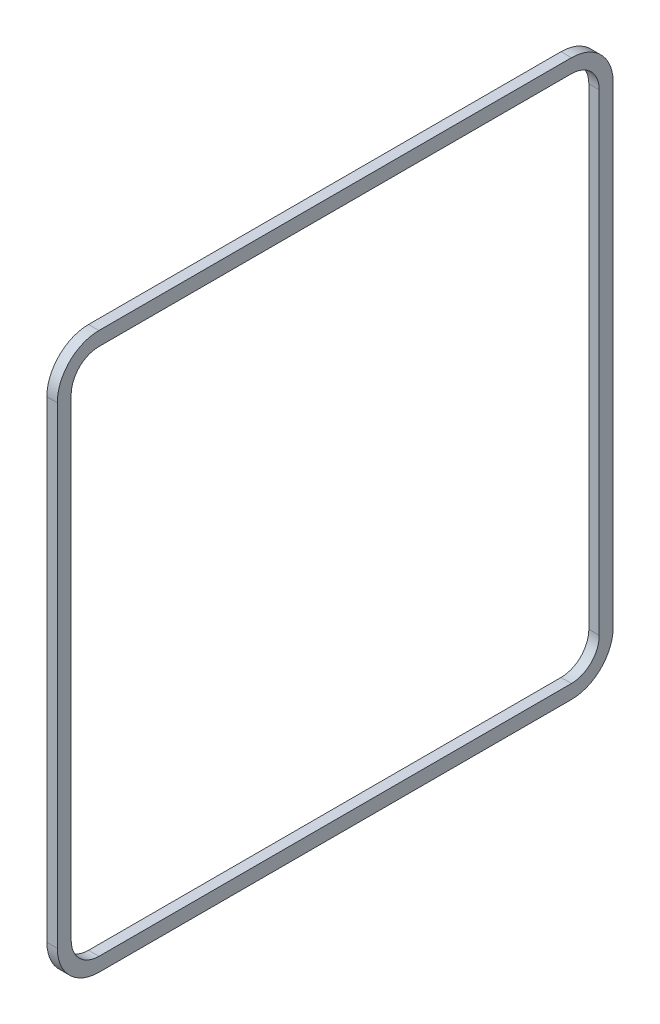
ISO-10303-21;
HEADER;
FILE_DESCRIPTION(('STEP AP214'),'2;1');
FILE_NAME('part.step','',(''),(''),'','','');
FILE_SCHEMA(('AUTOMOTIVE_DESIGN { 1 0 10303 214 1 1 1 1 }'));
ENDSEC;
DATA;
#1=APPLICATION_CONTEXT('core data for automotive mechanical design processes');
#2=APPLICATION_PROTOCOL_DEFINITION('international standard','automotive_design',2000,#1);
#3=PRODUCT_CONTEXT('',#1,'mechanical');
#4=PRODUCT('Part','Part','',(#3));
#5=PRODUCT_RELATED_PRODUCT_CATEGORY('part','',(#4));
#6=PRODUCT_DEFINITION_FORMATION('','',#4);
#7=PRODUCT_DEFINITION_CONTEXT('part definition',#1,'design');
#8=PRODUCT_DEFINITION('design','',#6,#7);
#9=PRODUCT_DEFINITION_SHAPE('','',#8);
#10=(LENGTH_UNIT() NAMED_UNIT(*) SI_UNIT(.MILLI.,.METRE.));
#11=(NAMED_UNIT(*) PLANE_ANGLE_UNIT() SI_UNIT($,.RADIAN.));
#12=(NAMED_UNIT(*) SI_UNIT($,.STERADIAN.) SOLID_ANGLE_UNIT());
#13=UNCERTAINTY_MEASURE_WITH_UNIT(LENGTH_MEASURE(1.E-05),#10,'distance_accuracy_value','');
#14=(GEOMETRIC_REPRESENTATION_CONTEXT(3) GLOBAL_UNCERTAINTY_ASSIGNED_CONTEXT((#13)) GLOBAL_UNIT_ASSIGNED_CONTEXT((#10,
#11,#12)) REPRESENTATION_CONTEXT('',''));
#15=CARTESIAN_POINT('',(0.,0.,0.));
#16=DIRECTION('',(0.,0.,1.));
#17=DIRECTION('',(1.,0.,0.));
#18=AXIS2_PLACEMENT_3D('',#15,#16,#17);
#19=CARTESIAN_POINT('',(1.5,-34.,34.));
#20=DIRECTION('',(1.,0.,0.));
#21=DIRECTION('',(0.,0.,-1.));
#22=AXIS2_PLACEMENT_3D('',#19,#20,#21);
#23=PLANE('',#22);
#24=CARTESIAN_POINT('',(1.5,-34.,34.));
#25=DIRECTION('',(1.,0.,0.));
#26=DIRECTION('',(0.,0.,-1.));
#27=AXIS2_PLACEMENT_3D('',#24,#25,#26);
#28=CIRCLE('',#27,6.);
#29=CARTESIAN_POINT('',(1.5,-34.,40.));
#30=VERTEX_POINT('',#29);
#31=CARTESIAN_POINT('',(1.5,-40.,34.));
#32=VERTEX_POINT('',#31);
#33=EDGE_CURVE('E213',#30,#32,#28,.T.);
#34=ORIENTED_EDGE('',*,*,#33,.T.);
#35=DIRECTION('',(0.,0.,-1.));
#36=VECTOR('',#35,1.);
#37=CARTESIAN_POINT('',(1.5,-40.,-34.));
#38=LINE('',#37,#36);
#39=CARTESIAN_POINT('',(1.5,-40.,-34.));
#40=VERTEX_POINT('',#39);
#41=EDGE_CURVE('E216',#32,#40,#38,.T.);
#42=ORIENTED_EDGE('',*,*,#41,.T.);
#43=CARTESIAN_POINT('',(1.5,-34.,-34.));
#44=DIRECTION('',(1.,0.,0.));
#45=DIRECTION('',(0.,0.,-1.));
#46=AXIS2_PLACEMENT_3D('',#43,#44,#45);
#47=CIRCLE('',#46,6.);
#48=CARTESIAN_POINT('',(1.5,-34.,-40.));
#49=VERTEX_POINT('',#48);
#50=EDGE_CURVE('E219',#40,#49,#47,.T.);
#51=ORIENTED_EDGE('',*,*,#50,.T.);
#52=DIRECTION('',(0.,1.,0.));
#53=VECTOR('',#52,1.);
#54=CARTESIAN_POINT('',(1.5,-34.,-40.));
#55=LINE('',#54,#53);
#56=CARTESIAN_POINT('',(1.5,34.,-40.));
#57=VERTEX_POINT('',#56);
#58=EDGE_CURVE('E221',#49,#57,#55,.T.);
#59=ORIENTED_EDGE('',*,*,#58,.T.);
#60=CARTESIAN_POINT('',(1.5,34.,-34.));
#61=DIRECTION('',(1.,0.,0.));
#62=DIRECTION('',(0.,0.,-1.));
#63=AXIS2_PLACEMENT_3D('',#60,#61,#62);
#64=CIRCLE('',#63,6.);
#65=CARTESIAN_POINT('',(1.5,40.,-34.));
#66=VERTEX_POINT('',#65);
#67=EDGE_CURVE('E223',#57,#66,#64,.T.);
#68=ORIENTED_EDGE('',*,*,#67,.T.);
#69=DIRECTION('',(0.,0.,1.));
#70=VECTOR('',#69,1.);
#71=CARTESIAN_POINT('',(1.5,40.,-34.));
#72=LINE('',#71,#70);
#73=CARTESIAN_POINT('',(1.5,40.,34.));
#74=VERTEX_POINT('',#73);
#75=EDGE_CURVE('E225',#66,#74,#72,.T.);
#76=ORIENTED_EDGE('',*,*,#75,.T.);
#77=CARTESIAN_POINT('',(1.5,34.,34.));
#78=DIRECTION('',(1.,0.,0.));
#79=DIRECTION('',(0.,0.,1.));
#80=AXIS2_PLACEMENT_3D('',#77,#78,#79);
#81=CIRCLE('',#80,5.99999999999999);
#82=CARTESIAN_POINT('',(1.5,34.,40.));
#83=VERTEX_POINT('',#82);
#84=EDGE_CURVE('E227',#74,#83,#81,.T.);
#85=ORIENTED_EDGE('',*,*,#84,.T.);
#86=DIRECTION('',(0.,-1.,0.));
#87=VECTOR('',#86,1.);
#88=CARTESIAN_POINT('',(1.5,-34.,40.));
#89=LINE('',#88,#87);
#90=EDGE_CURVE('E229',#83,#30,#89,.T.);
#91=ORIENTED_EDGE('',*,*,#90,.T.);
#92=EDGE_LOOP('',(#34,#42,#51,#59,#68,#76,#85,#91));
#93=FACE_BOUND('',#92,.T.);
#94=DIRECTION('',(0.,0.,1.));
#95=VECTOR('',#94,1.);
#96=CARTESIAN_POINT('',(1.5,38.,-34.));
#97=LINE('',#96,#95);
#98=CARTESIAN_POINT('',(1.5,38.,-34.));
#99=VERTEX_POINT('',#98);
#100=CARTESIAN_POINT('',(1.5,38.,34.));
#101=VERTEX_POINT('',#100);
#102=EDGE_CURVE('E156',#99,#101,#97,.T.);
#103=ORIENTED_EDGE('',*,*,#102,.F.);
#104=CARTESIAN_POINT('',(1.5,34.,-34.));
#105=DIRECTION('',(1.,0.,0.));
#106=DIRECTION('',(0.,0.,-1.));
#107=AXIS2_PLACEMENT_3D('',#104,#105,#106);
#108=CIRCLE('',#107,4.);
#109=CARTESIAN_POINT('',(1.5,34.,-38.));
#110=VERTEX_POINT('',#109);
#111=EDGE_CURVE('E148',#110,#99,#108,.T.);
#112=ORIENTED_EDGE('',*,*,#111,.F.);
#113=DIRECTION('',(0.,1.,0.));
#114=VECTOR('',#113,1.);
#115=CARTESIAN_POINT('',(1.5,-34.,-38.));
#116=LINE('',#115,#114);
#117=CARTESIAN_POINT('',(1.5,-34.,-38.));
#118=VERTEX_POINT('',#117);
#119=EDGE_CURVE('E181',#118,#110,#116,.T.);
#120=ORIENTED_EDGE('',*,*,#119,.F.);
#121=CARTESIAN_POINT('',(1.5,-34.,-34.));
#122=DIRECTION('',(1.,0.,0.));
#123=DIRECTION('',(0.,0.,-1.));
#124=AXIS2_PLACEMENT_3D('',#121,#122,#123);
#125=CIRCLE('',#124,4.);
#126=CARTESIAN_POINT('',(1.5,-38.,-34.));
#127=VERTEX_POINT('',#126);
#128=EDGE_CURVE('E179',#127,#118,#125,.T.);
#129=ORIENTED_EDGE('',*,*,#128,.F.);
#130=DIRECTION('',(0.,0.,-1.));
#131=VECTOR('',#130,1.);
#132=CARTESIAN_POINT('',(1.5,-38.,-34.));
#133=LINE('',#132,#131);
#134=CARTESIAN_POINT('',(1.5,-38.,34.));
#135=VERTEX_POINT('',#134);
#136=EDGE_CURVE('E177',#135,#127,#133,.T.);
#137=ORIENTED_EDGE('',*,*,#136,.F.);
#138=CARTESIAN_POINT('',(1.5,-34.,34.));
#139=DIRECTION('',(1.,0.,0.));
#140=DIRECTION('',(0.,0.,-1.));
#141=AXIS2_PLACEMENT_3D('',#138,#139,#140);
#142=CIRCLE('',#141,4.);
#143=CARTESIAN_POINT('',(1.5,-34.,38.));
#144=VERTEX_POINT('',#143);
#145=EDGE_CURVE('E175',#144,#135,#142,.T.);
#146=ORIENTED_EDGE('',*,*,#145,.F.);
#147=DIRECTION('',(0.,-1.,0.));
#148=VECTOR('',#147,1.);
#149=CARTESIAN_POINT('',(1.5,-34.,38.));
#150=LINE('',#149,#148);
#151=CARTESIAN_POINT('',(1.5,34.,38.));
#152=VERTEX_POINT('',#151);
#153=EDGE_CURVE('E171',#152,#144,#150,.T.);
#154=ORIENTED_EDGE('',*,*,#153,.F.);
#155=CARTESIAN_POINT('',(1.5,34.,34.));
#156=DIRECTION('',(1.,0.,0.));
#157=DIRECTION('',(0.,0.,1.));
#158=AXIS2_PLACEMENT_3D('',#155,#156,#157);
#159=CIRCLE('',#158,4.);
#160=EDGE_CURVE('E169',#101,#152,#159,.T.);
#161=ORIENTED_EDGE('',*,*,#160,.F.);
#162=EDGE_LOOP('',(#103,#112,#120,#129,#137,#146,#154,#161));
#163=FACE_BOUND('',#162,.T.);
#164=ADVANCED_FACE('F35',(#93,#163),#23,.T.);
#165=CARTESIAN_POINT('',(0.,-34.,34.));
#166=DIRECTION('',(1.,0.,0.));
#167=DIRECTION('',(0.,0.,-1.));
#168=AXIS2_PLACEMENT_3D('',#165,#166,#167);
#169=PLANE('',#168);
#170=CARTESIAN_POINT('',(0.,-34.,34.));
#171=DIRECTION('',(1.,0.,0.));
#172=DIRECTION('',(0.,0.,-1.));
#173=AXIS2_PLACEMENT_3D('',#170,#171,#172);
#174=CIRCLE('',#173,6.);
#175=CARTESIAN_POINT('',(0.,-34.,40.));
#176=VERTEX_POINT('',#175);
#177=CARTESIAN_POINT('',(0.,-40.,34.));
#178=VERTEX_POINT('',#177);
#179=EDGE_CURVE('E164',#176,#178,#174,.T.);
#180=ORIENTED_EDGE('',*,*,#179,.F.);
#181=DIRECTION('',(0.,-1.,0.));
#182=VECTOR('',#181,1.);
#183=CARTESIAN_POINT('',(0.,-34.,40.));
#184=LINE('',#183,#182);
#185=CARTESIAN_POINT('',(0.,34.,40.));
#186=VERTEX_POINT('',#185);
#187=EDGE_CURVE('E217',#186,#176,#184,.T.);
#188=ORIENTED_EDGE('',*,*,#187,.F.);
#189=CARTESIAN_POINT('',(0.,34.,34.));
#190=DIRECTION('',(1.,0.,0.));
#191=DIRECTION('',(0.,0.,1.));
#192=AXIS2_PLACEMENT_3D('',#189,#190,#191);
#193=CIRCLE('',#192,5.99999999999999);
#194=CARTESIAN_POINT('',(0.,40.,34.));
#195=VERTEX_POINT('',#194);
#196=EDGE_CURVE('E244',#195,#186,#193,.T.);
#197=ORIENTED_EDGE('',*,*,#196,.F.);
#198=DIRECTION('',(0.,0.,1.));
#199=VECTOR('',#198,1.);
#200=CARTESIAN_POINT('',(0.,40.,-34.));
#201=LINE('',#200,#199);
#202=CARTESIAN_POINT('',(0.,40.,-34.));
#203=VERTEX_POINT('',#202);
#204=EDGE_CURVE('E242',#203,#195,#201,.T.);
#205=ORIENTED_EDGE('',*,*,#204,.F.);
#206=CARTESIAN_POINT('',(0.,34.,-34.));
#207=DIRECTION('',(1.,0.,0.));
#208=DIRECTION('',(0.,0.,-1.));
#209=AXIS2_PLACEMENT_3D('',#206,#207,#208);
#210=CIRCLE('',#209,6.);
#211=CARTESIAN_POINT('',(0.,34.,-40.));
#212=VERTEX_POINT('',#211);
#213=EDGE_CURVE('E240',#212,#203,#210,.T.);
#214=ORIENTED_EDGE('',*,*,#213,.F.);
#215=DIRECTION('',(0.,1.,0.));
#216=VECTOR('',#215,1.);
#217=CARTESIAN_POINT('',(0.,-34.,-40.));
#218=LINE('',#217,#216);
#219=CARTESIAN_POINT('',(0.,-34.,-40.));
#220=VERTEX_POINT('',#219);
#221=EDGE_CURVE('E238',#220,#212,#218,.T.);
#222=ORIENTED_EDGE('',*,*,#221,.F.);
#223=CARTESIAN_POINT('',(0.,-34.,-34.));
#224=DIRECTION('',(1.,0.,0.));
#225=DIRECTION('',(0.,0.,-1.));
#226=AXIS2_PLACEMENT_3D('',#223,#224,#225);
#227=CIRCLE('',#226,6.);
#228=CARTESIAN_POINT('',(0.,-40.,-34.));
#229=VERTEX_POINT('',#228);
#230=EDGE_CURVE('E236',#229,#220,#227,.T.);
#231=ORIENTED_EDGE('',*,*,#230,.F.);
#232=DIRECTION('',(0.,0.,-1.));
#233=VECTOR('',#232,1.);
#234=CARTESIAN_POINT('',(0.,-40.,-34.));
#235=LINE('',#234,#233);
#236=EDGE_CURVE('E234',#178,#229,#235,.T.);
#237=ORIENTED_EDGE('',*,*,#236,.F.);
#238=EDGE_LOOP('',(#180,#188,#197,#205,#214,#222,#231,#237));
#239=FACE_BOUND('',#238,.T.);
#240=CARTESIAN_POINT('',(0.,34.,-34.));
#241=DIRECTION('',(1.,0.,0.));
#242=DIRECTION('',(0.,0.,-1.));
#243=AXIS2_PLACEMENT_3D('',#240,#241,#242);
#244=CIRCLE('',#243,4.);
#245=CARTESIAN_POINT('',(0.,34.,-38.));
#246=VERTEX_POINT('',#245);
#247=CARTESIAN_POINT('',(0.,38.,-34.));
#248=VERTEX_POINT('',#247);
#249=EDGE_CURVE('E58',#246,#248,#244,.T.);
#250=ORIENTED_EDGE('',*,*,#249,.T.);
#251=DIRECTION('',(0.,0.,1.));
#252=VECTOR('',#251,1.);
#253=CARTESIAN_POINT('',(0.,38.,-34.));
#254=LINE('',#253,#252);
#255=CARTESIAN_POINT('',(0.,38.,34.));
#256=VERTEX_POINT('',#255);
#257=EDGE_CURVE('E163',#248,#256,#254,.T.);
#258=ORIENTED_EDGE('',*,*,#257,.T.);
#259=CARTESIAN_POINT('',(0.,34.,34.));
#260=DIRECTION('',(1.,0.,0.));
#261=DIRECTION('',(0.,0.,1.));
#262=AXIS2_PLACEMENT_3D('',#259,#260,#261);
#263=CIRCLE('',#262,4.);
#264=CARTESIAN_POINT('',(0.,34.,38.));
#265=VERTEX_POINT('',#264);
#266=EDGE_CURVE('E185',#256,#265,#263,.T.);
#267=ORIENTED_EDGE('',*,*,#266,.T.);
#268=DIRECTION('',(0.,-1.,0.));
#269=VECTOR('',#268,1.);
#270=CARTESIAN_POINT('',(0.,-34.,38.));
#271=LINE('',#270,#269);
#272=CARTESIAN_POINT('',(0.,-34.,38.));
#273=VERTEX_POINT('',#272);
#274=EDGE_CURVE('E188',#265,#273,#271,.T.);
#275=ORIENTED_EDGE('',*,*,#274,.T.);
#276=CARTESIAN_POINT('',(0.,-34.,34.));
#277=DIRECTION('',(1.,0.,0.));
#278=DIRECTION('',(0.,0.,-1.));
#279=AXIS2_PLACEMENT_3D('',#276,#277,#278);
#280=CIRCLE('',#279,4.);
#281=CARTESIAN_POINT('',(0.,-38.,34.));
#282=VERTEX_POINT('',#281);
#283=EDGE_CURVE('E191',#273,#282,#280,.T.);
#284=ORIENTED_EDGE('',*,*,#283,.T.);
#285=DIRECTION('',(0.,0.,-1.));
#286=VECTOR('',#285,1.);
#287=CARTESIAN_POINT('',(0.,-38.,-34.));
#288=LINE('',#287,#286);
#289=CARTESIAN_POINT('',(0.,-38.,-34.));
#290=VERTEX_POINT('',#289);
#291=EDGE_CURVE('E194',#282,#290,#288,.T.);
#292=ORIENTED_EDGE('',*,*,#291,.T.);
#293=CARTESIAN_POINT('',(0.,-34.,-34.));
#294=DIRECTION('',(1.,0.,0.));
#295=DIRECTION('',(0.,0.,-1.));
#296=AXIS2_PLACEMENT_3D('',#293,#294,#295);
#297=CIRCLE('',#296,4.);
#298=CARTESIAN_POINT('',(0.,-34.,-38.));
#299=VERTEX_POINT('',#298);
#300=EDGE_CURVE('E197',#290,#299,#297,.T.);
#301=ORIENTED_EDGE('',*,*,#300,.T.);
#302=DIRECTION('',(0.,1.,0.));
#303=VECTOR('',#302,1.);
#304=CARTESIAN_POINT('',(0.,-34.,-38.));
#305=LINE('',#304,#303);
#306=EDGE_CURVE('E157',#299,#246,#305,.T.);
#307=ORIENTED_EDGE('',*,*,#306,.T.);
#308=EDGE_LOOP('',(#250,#258,#267,#275,#284,#292,#301,#307));
#309=FACE_BOUND('',#308,.T.);
#310=ADVANCED_FACE('F274',(#239,#309),#169,.F.);
#311=CARTESIAN_POINT('',(1.5,-34.,34.));
#312=DIRECTION('',(-1.,0.,0.));
#313=DIRECTION('',(0.,0.,1.));
#314=AXIS2_PLACEMENT_3D('',#311,#312,#313);
#315=CYLINDRICAL_SURFACE('',#314,6.);
#316=ORIENTED_EDGE('',*,*,#179,.T.);
#317=DIRECTION('',(-1.,0.,0.));
#318=VECTOR('',#317,1.);
#319=CARTESIAN_POINT('',(1.5,-40.,34.));
#320=LINE('',#319,#318);
#321=EDGE_CURVE('E11',#32,#178,#320,.T.);
#322=ORIENTED_EDGE('',*,*,#321,.F.);
#323=ORIENTED_EDGE('',*,*,#33,.F.);
#324=DIRECTION('',(-1.,0.,0.));
#325=VECTOR('',#324,1.);
#326=CARTESIAN_POINT('',(1.5,-34.,40.));
#327=LINE('',#326,#325);
#328=EDGE_CURVE('E231',#30,#176,#327,.T.);
#329=ORIENTED_EDGE('',*,*,#328,.T.);
#330=EDGE_LOOP('',(#316,#322,#323,#329));
#331=FACE_BOUND('',#330,.T.);
#332=ADVANCED_FACE('F37',(#331),#315,.T.);
#333=CARTESIAN_POINT('',(1.5,-40.,-34.));
#334=DIRECTION('',(0.,1.,0.));
#335=DIRECTION('',(0.,0.,1.));
#336=AXIS2_PLACEMENT_3D('',#333,#334,#335);
#337=PLANE('',#336);
#338=ORIENTED_EDGE('',*,*,#236,.T.);
#339=DIRECTION('',(-1.,0.,0.));
#340=VECTOR('',#339,1.);
#341=CARTESIAN_POINT('',(1.5,-40.,-34.));
#342=LINE('',#341,#340);
#343=EDGE_CURVE('E43',#40,#229,#342,.T.);
#344=ORIENTED_EDGE('',*,*,#343,.F.);
#345=ORIENTED_EDGE('',*,*,#41,.F.);
#346=ORIENTED_EDGE('',*,*,#321,.T.);
#347=EDGE_LOOP('',(#338,#344,#345,#346));
#348=FACE_BOUND('',#347,.T.);
#349=ADVANCED_FACE('F291',(#348),#337,.F.);
#350=CARTESIAN_POINT('',(1.5,-34.,-34.));
#351=DIRECTION('',(-1.,0.,0.));
#352=DIRECTION('',(0.,0.,1.));
#353=AXIS2_PLACEMENT_3D('',#350,#351,#352);
#354=CYLINDRICAL_SURFACE('',#353,6.);
#355=ORIENTED_EDGE('',*,*,#230,.T.);
#356=DIRECTION('',(-1.,0.,0.));
#357=VECTOR('',#356,1.);
#358=CARTESIAN_POINT('',(1.5,-34.,-40.));
#359=LINE('',#358,#357);
#360=EDGE_CURVE('E261',#49,#220,#359,.T.);
#361=ORIENTED_EDGE('',*,*,#360,.F.);
#362=ORIENTED_EDGE('',*,*,#50,.F.);
#363=ORIENTED_EDGE('',*,*,#343,.T.);
#364=EDGE_LOOP('',(#355,#361,#362,#363));
#365=FACE_BOUND('',#364,.T.);
#366=ADVANCED_FACE('F268',(#365),#354,.T.);
#367=CARTESIAN_POINT('',(1.5,-34.,-40.));
#368=DIRECTION('',(0.,0.,1.));
#369=DIRECTION('',(0.,-1.,0.));
#370=AXIS2_PLACEMENT_3D('',#367,#368,#369);
#371=PLANE('',#370);
#372=ORIENTED_EDGE('',*,*,#221,.T.);
#373=DIRECTION('',(-1.,0.,0.));
#374=VECTOR('',#373,1.);
#375=CARTESIAN_POINT('',(1.5,34.,-40.));
#376=LINE('',#375,#374);
#377=EDGE_CURVE('E258',#57,#212,#376,.T.);
#378=ORIENTED_EDGE('',*,*,#377,.F.);
#379=ORIENTED_EDGE('',*,*,#58,.F.);
#380=ORIENTED_EDGE('',*,*,#360,.T.);
#381=EDGE_LOOP('',(#372,#378,#379,#380));
#382=FACE_BOUND('',#381,.T.);
#383=ADVANCED_FACE('F280',(#382),#371,.F.);
#384=CARTESIAN_POINT('',(1.5,34.,-34.));
#385=DIRECTION('',(-1.,0.,0.));
#386=DIRECTION('',(0.,0.,1.));
#387=AXIS2_PLACEMENT_3D('',#384,#385,#386);
#388=CYLINDRICAL_SURFACE('',#387,6.);
#389=ORIENTED_EDGE('',*,*,#213,.T.);
#390=DIRECTION('',(-1.,0.,0.));
#391=VECTOR('',#390,1.);
#392=CARTESIAN_POINT('',(1.5,40.,-34.));
#393=LINE('',#392,#391);
#394=EDGE_CURVE('E255',#66,#203,#393,.T.);
#395=ORIENTED_EDGE('',*,*,#394,.F.);
#396=ORIENTED_EDGE('',*,*,#67,.F.);
#397=ORIENTED_EDGE('',*,*,#377,.T.);
#398=EDGE_LOOP('',(#389,#395,#396,#397));
#399=FACE_BOUND('',#398,.T.);
#400=ADVANCED_FACE('F284',(#399),#388,.T.);
#401=CARTESIAN_POINT('',(1.5,40.,-34.));
#402=DIRECTION('',(0.,-1.,0.));
#403=DIRECTION('',(0.,0.,-1.));
#404=AXIS2_PLACEMENT_3D('',#401,#402,#403);
#405=PLANE('',#404);
#406=ORIENTED_EDGE('',*,*,#204,.T.);
#407=DIRECTION('',(-1.,0.,0.));
#408=VECTOR('',#407,1.);
#409=CARTESIAN_POINT('',(1.5,40.,34.));
#410=LINE('',#409,#408);
#411=EDGE_CURVE('E252',#74,#195,#410,.T.);
#412=ORIENTED_EDGE('',*,*,#411,.F.);
#413=ORIENTED_EDGE('',*,*,#75,.F.);
#414=ORIENTED_EDGE('',*,*,#394,.T.);
#415=EDGE_LOOP('',(#406,#412,#413,#414));
#416=FACE_BOUND('',#415,.T.);
#417=ADVANCED_FACE('F304',(#416),#405,.F.);
#418=CARTESIAN_POINT('',(1.5,34.,34.));
#419=DIRECTION('',(-1.,0.,0.));
#420=DIRECTION('',(0.,0.,1.));
#421=AXIS2_PLACEMENT_3D('',#418,#419,#420);
#422=CYLINDRICAL_SURFACE('',#421,5.99999999999999);
#423=ORIENTED_EDGE('',*,*,#196,.T.);
#424=DIRECTION('',(-1.,0.,0.));
#425=VECTOR('',#424,1.);
#426=CARTESIAN_POINT('',(1.5,34.,40.));
#427=LINE('',#426,#425);
#428=EDGE_CURVE('E249',#83,#186,#427,.T.);
#429=ORIENTED_EDGE('',*,*,#428,.F.);
#430=ORIENTED_EDGE('',*,*,#84,.F.);
#431=ORIENTED_EDGE('',*,*,#411,.T.);
#432=EDGE_LOOP('',(#423,#429,#430,#431));
#433=FACE_BOUND('',#432,.T.);
#434=ADVANCED_FACE('F302',(#433),#422,.T.);
#435=CARTESIAN_POINT('',(1.5,-34.,40.));
#436=DIRECTION('',(0.,0.,-1.));
#437=DIRECTION('',(0.,1.,0.));
#438=AXIS2_PLACEMENT_3D('',#435,#436,#437);
#439=PLANE('',#438);
#440=ORIENTED_EDGE('',*,*,#187,.T.);
#441=ORIENTED_EDGE('',*,*,#328,.F.);
#442=ORIENTED_EDGE('',*,*,#90,.F.);
#443=ORIENTED_EDGE('',*,*,#428,.T.);
#444=EDGE_LOOP('',(#440,#441,#442,#443));
#445=FACE_BOUND('',#444,.T.);
#446=ADVANCED_FACE('F297',(#445),#439,.F.);
#447=CARTESIAN_POINT('',(1.5,34.,-34.));
#448=DIRECTION('',(-1.,0.,0.));
#449=DIRECTION('',(0.,0.,1.));
#450=AXIS2_PLACEMENT_3D('',#447,#448,#449);
#451=CYLINDRICAL_SURFACE('',#450,4.);
#452=ORIENTED_EDGE('',*,*,#249,.F.);
#453=DIRECTION('',(-1.,0.,0.));
#454=VECTOR('',#453,1.);
#455=CARTESIAN_POINT('',(1.5,34.,-38.));
#456=LINE('',#455,#454);
#457=EDGE_CURVE('E152',#110,#246,#456,.T.);
#458=ORIENTED_EDGE('',*,*,#457,.F.);
#459=ORIENTED_EDGE('',*,*,#111,.T.);
#460=DIRECTION('',(-1.,0.,0.));
#461=VECTOR('',#460,1.);
#462=CARTESIAN_POINT('',(1.5,38.,-34.));
#463=LINE('',#462,#461);
#464=EDGE_CURVE('E151',#99,#248,#463,.T.);
#465=ORIENTED_EDGE('',*,*,#464,.T.);
#466=EDGE_LOOP('',(#452,#458,#459,#465));
#467=FACE_BOUND('',#466,.T.);
#468=ADVANCED_FACE('F150',(#467),#451,.F.);
#469=CARTESIAN_POINT('',(1.5,38.,-34.));
#470=DIRECTION('',(0.,-1.,0.));
#471=DIRECTION('',(0.,0.,-1.));
#472=AXIS2_PLACEMENT_3D('',#469,#470,#471);
#473=PLANE('',#472);
#474=ORIENTED_EDGE('',*,*,#257,.F.);
#475=ORIENTED_EDGE('',*,*,#464,.F.);
#476=ORIENTED_EDGE('',*,*,#102,.T.);
#477=DIRECTION('',(-1.,0.,0.));
#478=VECTOR('',#477,1.);
#479=CARTESIAN_POINT('',(1.5,38.,34.));
#480=LINE('',#479,#478);
#481=EDGE_CURVE('E165',#101,#256,#480,.T.);
#482=ORIENTED_EDGE('',*,*,#481,.T.);
#483=EDGE_LOOP('',(#474,#475,#476,#482));
#484=FACE_BOUND('',#483,.T.);
#485=ADVANCED_FACE('F160',(#484),#473,.T.);
#486=CARTESIAN_POINT('',(1.5,34.,34.));
#487=DIRECTION('',(-1.,0.,0.));
#488=DIRECTION('',(0.,0.,1.));
#489=AXIS2_PLACEMENT_3D('',#486,#487,#488);
#490=CYLINDRICAL_SURFACE('',#489,4.);
#491=ORIENTED_EDGE('',*,*,#266,.F.);
#492=ORIENTED_EDGE('',*,*,#481,.F.);
#493=ORIENTED_EDGE('',*,*,#160,.T.);
#494=DIRECTION('',(-1.,0.,0.));
#495=VECTOR('',#494,1.);
#496=CARTESIAN_POINT('',(1.5,34.,38.));
#497=LINE('',#496,#495);
#498=EDGE_CURVE('E210',#152,#265,#497,.T.);
#499=ORIENTED_EDGE('',*,*,#498,.T.);
#500=EDGE_LOOP('',(#491,#492,#493,#499));
#501=FACE_BOUND('',#500,.T.);
#502=ADVANCED_FACE('F329',(#501),#490,.F.);
#503=CARTESIAN_POINT('',(1.5,-34.,38.));
#504=DIRECTION('',(0.,0.,-1.));
#505=DIRECTION('',(-1.,0.,0.));
#506=AXIS2_PLACEMENT_3D('',#503,#504,#505);
#507=PLANE('',#506);
#508=ORIENTED_EDGE('',*,*,#274,.F.);
#509=ORIENTED_EDGE('',*,*,#498,.F.);
#510=ORIENTED_EDGE('',*,*,#153,.T.);
#511=DIRECTION('',(-1.,0.,0.));
#512=VECTOR('',#511,1.);
#513=CARTESIAN_POINT('',(1.5,-34.,38.));
#514=LINE('',#513,#512);
#515=EDGE_CURVE('E208',#144,#273,#514,.T.);
#516=ORIENTED_EDGE('',*,*,#515,.T.);
#517=EDGE_LOOP('',(#508,#509,#510,#516));
#518=FACE_BOUND('',#517,.T.);
#519=ADVANCED_FACE('F333',(#518),#507,.T.);
#520=CARTESIAN_POINT('',(1.5,-34.,34.));
#521=DIRECTION('',(-1.,0.,0.));
#522=DIRECTION('',(0.,0.,1.));
#523=AXIS2_PLACEMENT_3D('',#520,#521,#522);
#524=CYLINDRICAL_SURFACE('',#523,4.);
#525=ORIENTED_EDGE('',*,*,#283,.F.);
#526=ORIENTED_EDGE('',*,*,#515,.F.);
#527=ORIENTED_EDGE('',*,*,#145,.T.);
#528=DIRECTION('',(-1.,0.,0.));
#529=VECTOR('',#528,1.);
#530=CARTESIAN_POINT('',(1.5,-38.,34.));
#531=LINE('',#530,#529);
#532=EDGE_CURVE('E206',#135,#282,#531,.T.);
#533=ORIENTED_EDGE('',*,*,#532,.T.);
#534=EDGE_LOOP('',(#525,#526,#527,#533));
#535=FACE_BOUND('',#534,.T.);
#536=ADVANCED_FACE('F339',(#535),#524,.F.);
#537=CARTESIAN_POINT('',(1.5,-38.,-34.));
#538=DIRECTION('',(0.,1.,0.));
#539=DIRECTION('',(0.,0.,1.));
#540=AXIS2_PLACEMENT_3D('',#537,#538,#539);
#541=PLANE('',#540);
#542=ORIENTED_EDGE('',*,*,#291,.F.);
#543=ORIENTED_EDGE('',*,*,#532,.F.);
#544=ORIENTED_EDGE('',*,*,#136,.T.);
#545=DIRECTION('',(-1.,0.,0.));
#546=VECTOR('',#545,1.);
#547=CARTESIAN_POINT('',(1.5,-38.,-34.));
#548=LINE('',#547,#546);
#549=EDGE_CURVE('E204',#127,#290,#548,.T.);
#550=ORIENTED_EDGE('',*,*,#549,.T.);
#551=EDGE_LOOP('',(#542,#543,#544,#550));
#552=FACE_BOUND('',#551,.T.);
#553=ADVANCED_FACE('F343',(#552),#541,.T.);
#554=CARTESIAN_POINT('',(1.5,-34.,-34.));
#555=DIRECTION('',(-1.,0.,0.));
#556=DIRECTION('',(0.,0.,1.));
#557=AXIS2_PLACEMENT_3D('',#554,#555,#556);
#558=CYLINDRICAL_SURFACE('',#557,4.);
#559=ORIENTED_EDGE('',*,*,#300,.F.);
#560=ORIENTED_EDGE('',*,*,#549,.F.);
#561=ORIENTED_EDGE('',*,*,#128,.T.);
#562=DIRECTION('',(-1.,0.,0.));
#563=VECTOR('',#562,1.);
#564=CARTESIAN_POINT('',(1.5,-34.,-38.));
#565=LINE('',#564,#563);
#566=EDGE_CURVE('E50',#118,#299,#565,.T.);
#567=ORIENTED_EDGE('',*,*,#566,.T.);
#568=EDGE_LOOP('',(#559,#560,#561,#567));
#569=FACE_BOUND('',#568,.T.);
#570=ADVANCED_FACE('F347',(#569),#558,.F.);
#571=CARTESIAN_POINT('',(1.5,-34.,-38.));
#572=DIRECTION('',(0.,0.,1.));
#573=DIRECTION('',(1.,0.,0.));
#574=AXIS2_PLACEMENT_3D('',#571,#572,#573);
#575=PLANE('',#574);
#576=ORIENTED_EDGE('',*,*,#306,.F.);
#577=ORIENTED_EDGE('',*,*,#566,.F.);
#578=ORIENTED_EDGE('',*,*,#119,.T.);
#579=ORIENTED_EDGE('',*,*,#457,.T.);
#580=EDGE_LOOP('',(#576,#577,#578,#579));
#581=FACE_BOUND('',#580,.T.);
#582=ADVANCED_FACE('F351',(#581),#575,.T.);
#583=CLOSED_SHELL('',(#164,#310,#332,#349,#366,#383,#400,#417,#434,#446,#468,#485,#502,#519,
#536,#553,#570,#582));
#584=MANIFOLD_SOLID_BREP('B2',#583);
#585=ADVANCED_BREP_SHAPE_REPRESENTATION('',(#18,#584),#14);
#586=SHAPE_DEFINITION_REPRESENTATION(#9,#585);
ENDSEC;
END-ISO-10303-21;
